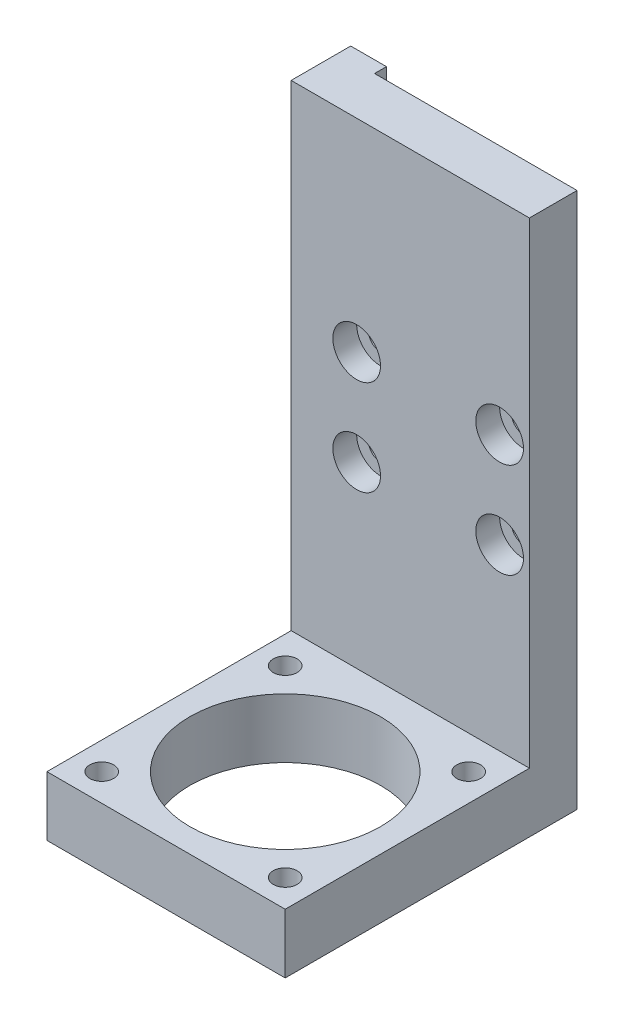
ISO-10303-21;
HEADER;
FILE_DESCRIPTION(('STEP AP214'),'2;1');
FILE_NAME('part.step','',(''),(''),'','','');
FILE_SCHEMA(('AUTOMOTIVE_DESIGN { 1 0 10303 214 1 1 1 1 }'));
ENDSEC;
DATA;
#1=APPLICATION_CONTEXT('core data for automotive mechanical design processes');
#2=APPLICATION_PROTOCOL_DEFINITION('international standard','automotive_design',2000,#1);
#3=PRODUCT_CONTEXT('',#1,'mechanical');
#4=PRODUCT('Part','Part','',(#3));
#5=PRODUCT_RELATED_PRODUCT_CATEGORY('part','',(#4));
#6=PRODUCT_DEFINITION_FORMATION('','',#4);
#7=PRODUCT_DEFINITION_CONTEXT('part definition',#1,'design');
#8=PRODUCT_DEFINITION('design','',#6,#7);
#9=PRODUCT_DEFINITION_SHAPE('','',#8);
#10=(LENGTH_UNIT() NAMED_UNIT(*) SI_UNIT(.MILLI.,.METRE.));
#11=(NAMED_UNIT(*) PLANE_ANGLE_UNIT() SI_UNIT($,.RADIAN.));
#12=(NAMED_UNIT(*) SI_UNIT($,.STERADIAN.) SOLID_ANGLE_UNIT());
#13=UNCERTAINTY_MEASURE_WITH_UNIT(LENGTH_MEASURE(1.E-05),#10,'distance_accuracy_value','');
#14=(GEOMETRIC_REPRESENTATION_CONTEXT(3) GLOBAL_UNCERTAINTY_ASSIGNED_CONTEXT((#13)) GLOBAL_UNIT_ASSIGNED_CONTEXT((#10,
#11,#12)) REPRESENTATION_CONTEXT('',''));
#15=CARTESIAN_POINT('',(0.,0.,0.));
#16=DIRECTION('',(0.,0.,1.));
#17=DIRECTION('',(1.,0.,0.));
#18=AXIS2_PLACEMENT_3D('',#15,#16,#17);
#19=CARTESIAN_POINT('',(5.5,15.,-30.5));
#20=DIRECTION('',(0.,0.,1.));
#21=DIRECTION('',(1.,0.,0.));
#22=AXIS2_PLACEMENT_3D('',#19,#20,#21);
#23=CYLINDRICAL_SURFACE('',#22,1.);
#24=CARTESIAN_POINT('',(5.5,15.,-24.5));
#25=DIRECTION('',(0.,0.,1.));
#26=DIRECTION('',(1.,0.,0.));
#27=AXIS2_PLACEMENT_3D('',#24,#25,#26);
#28=CIRCLE('',#27,1.);
#29=CARTESIAN_POINT('',(6.5,15.,-24.5));
#30=VERTEX_POINT('',#29);
#31=EDGE_CURVE('E542',#30,#30,#28,.F.);
#32=ORIENTED_EDGE('',*,*,#31,.T.);
#33=EDGE_LOOP('',(#32));
#34=FACE_BOUND('',#33,.T.);
#35=CARTESIAN_POINT('',(5.5,15.,-22.5));
#36=DIRECTION('',(0.,0.,1.));
#37=DIRECTION('',(1.,0.,0.));
#38=AXIS2_PLACEMENT_3D('',#35,#36,#37);
#39=CIRCLE('',#38,1.);
#40=CARTESIAN_POINT('',(6.5,15.,-22.5));
#41=VERTEX_POINT('',#40);
#42=EDGE_CURVE('E152',#41,#41,#39,.F.);
#43=ORIENTED_EDGE('',*,*,#42,.F.);
#44=EDGE_LOOP('',(#43));
#45=FACE_BOUND('',#44,.T.);
#46=ADVANCED_FACE('F36',(#34,#45),#23,.F.);
#47=CARTESIAN_POINT('',(5.50000000000001,23.,-30.5));
#48=DIRECTION('',(0.,0.,1.));
#49=DIRECTION('',(1.,0.,0.));
#50=AXIS2_PLACEMENT_3D('',#47,#48,#49);
#51=CYLINDRICAL_SURFACE('',#50,1.);
#52=CARTESIAN_POINT('',(5.50000000000001,23.,-24.5));
#53=DIRECTION('',(0.,0.,1.));
#54=DIRECTION('',(1.,0.,0.));
#55=AXIS2_PLACEMENT_3D('',#52,#53,#54);
#56=CIRCLE('',#55,1.);
#57=CARTESIAN_POINT('',(6.50000000000001,23.,-24.5));
#58=VERTEX_POINT('',#57);
#59=EDGE_CURVE('E547',#58,#58,#56,.F.);
#60=ORIENTED_EDGE('',*,*,#59,.T.);
#61=EDGE_LOOP('',(#60));
#62=FACE_BOUND('',#61,.T.);
#63=CARTESIAN_POINT('',(5.50000000000001,23.,-22.5));
#64=DIRECTION('',(0.,0.,1.));
#65=DIRECTION('',(1.,0.,0.));
#66=AXIS2_PLACEMENT_3D('',#63,#64,#65);
#67=CIRCLE('',#66,1.);
#68=CARTESIAN_POINT('',(6.50000000000001,23.,-22.5));
#69=VERTEX_POINT('',#68);
#70=EDGE_CURVE('E150',#69,#69,#67,.F.);
#71=ORIENTED_EDGE('',*,*,#70,.F.);
#72=EDGE_LOOP('',(#71));
#73=FACE_BOUND('',#72,.T.);
#74=ADVANCED_FACE('F236',(#62,#73),#51,.F.);
#75=CARTESIAN_POINT('',(17.5,23.,-30.5));
#76=DIRECTION('',(0.,0.,1.));
#77=DIRECTION('',(1.,0.,0.));
#78=AXIS2_PLACEMENT_3D('',#75,#76,#77);
#79=CYLINDRICAL_SURFACE('',#78,1.00000000000001);
#80=CARTESIAN_POINT('',(17.5,23.,-24.5));
#81=DIRECTION('',(0.,0.,1.));
#82=DIRECTION('',(1.,0.,0.));
#83=AXIS2_PLACEMENT_3D('',#80,#81,#82);
#84=CIRCLE('',#83,1.00000000000001);
#85=CARTESIAN_POINT('',(18.5,23.,-24.5));
#86=VERTEX_POINT('',#85);
#87=EDGE_CURVE('E601',#86,#86,#84,.F.);
#88=ORIENTED_EDGE('',*,*,#87,.T.);
#89=EDGE_LOOP('',(#88));
#90=FACE_BOUND('',#89,.T.);
#91=CARTESIAN_POINT('',(17.5,23.,-22.5));
#92=DIRECTION('',(0.,0.,1.));
#93=DIRECTION('',(1.,0.,0.));
#94=AXIS2_PLACEMENT_3D('',#91,#92,#93);
#95=CIRCLE('',#94,1.00000000000001);
#96=CARTESIAN_POINT('',(18.5,23.,-22.5));
#97=VERTEX_POINT('',#96);
#98=EDGE_CURVE('E146',#97,#97,#95,.F.);
#99=ORIENTED_EDGE('',*,*,#98,.F.);
#100=EDGE_LOOP('',(#99));
#101=FACE_BOUND('',#100,.T.);
#102=ADVANCED_FACE('F243',(#90,#101),#79,.F.);
#103=CARTESIAN_POINT('',(17.5,15.,-30.5));
#104=DIRECTION('',(0.,0.,1.));
#105=DIRECTION('',(1.,0.,0.));
#106=AXIS2_PLACEMENT_3D('',#103,#104,#105);
#107=CYLINDRICAL_SURFACE('',#106,1.00000000000001);
#108=CARTESIAN_POINT('',(17.5,15.,-24.5));
#109=DIRECTION('',(0.,0.,1.));
#110=DIRECTION('',(1.,0.,0.));
#111=AXIS2_PLACEMENT_3D('',#108,#109,#110);
#112=CIRCLE('',#111,1.00000000000001);
#113=CARTESIAN_POINT('',(18.5,15.,-24.5));
#114=VERTEX_POINT('',#113);
#115=EDGE_CURVE('E604',#114,#114,#112,.F.);
#116=ORIENTED_EDGE('',*,*,#115,.T.);
#117=EDGE_LOOP('',(#116));
#118=FACE_BOUND('',#117,.T.);
#119=CARTESIAN_POINT('',(17.5,15.,-22.5));
#120=DIRECTION('',(0.,0.,1.));
#121=DIRECTION('',(1.,0.,0.));
#122=AXIS2_PLACEMENT_3D('',#119,#120,#121);
#123=CIRCLE('',#122,1.00000000000001);
#124=CARTESIAN_POINT('',(18.5,15.,-22.5));
#125=VERTEX_POINT('',#124);
#126=EDGE_CURVE('E143',#125,#125,#123,.F.);
#127=ORIENTED_EDGE('',*,*,#126,.F.);
#128=EDGE_LOOP('',(#127));
#129=FACE_BOUND('',#128,.T.);
#130=ADVANCED_FACE('F250',(#118,#129),#107,.F.);
#131=CARTESIAN_POINT('',(20.,-5.,0.));
#132=DIRECTION('',(0.,0.,-1.));
#133=DIRECTION('',(-1.,0.,0.));
#134=AXIS2_PLACEMENT_3D('',#131,#132,#133);
#135=PLANE('',#134);
#136=DIRECTION('',(0.,-1.,0.));
#137=VECTOR('',#136,1.);
#138=CARTESIAN_POINT('',(0.,-5.,0.));
#139=LINE('',#138,#137);
#140=CARTESIAN_POINT('',(0.,0.,0.));
#141=VERTEX_POINT('',#140);
#142=CARTESIAN_POINT('',(0.,-5.,0.));
#143=VERTEX_POINT('',#142);
#144=EDGE_CURVE('E186',#141,#143,#139,.T.);
#145=ORIENTED_EDGE('',*,*,#144,.T.);
#146=DIRECTION('',(-1.,0.,0.));
#147=VECTOR('',#146,1.);
#148=CARTESIAN_POINT('',(20.,-5.,0.));
#149=LINE('',#148,#147);
#150=CARTESIAN_POINT('',(20.,-5.,0.));
#151=VERTEX_POINT('',#150);
#152=EDGE_CURVE('E44',#151,#143,#149,.T.);
#153=ORIENTED_EDGE('',*,*,#152,.F.);
#154=DIRECTION('',(0.,-1.,0.));
#155=VECTOR('',#154,1.);
#156=CARTESIAN_POINT('',(20.,-5.,0.));
#157=LINE('',#156,#155);
#158=CARTESIAN_POINT('',(20.,0.,0.));
#159=VERTEX_POINT('',#158);
#160=EDGE_CURVE('E187',#159,#151,#157,.T.);
#161=ORIENTED_EDGE('',*,*,#160,.F.);
#162=DIRECTION('',(-1.,0.,0.));
#163=VECTOR('',#162,1.);
#164=CARTESIAN_POINT('',(20.,0.,0.));
#165=LINE('',#164,#163);
#166=EDGE_CURVE('E195',#159,#141,#165,.T.);
#167=ORIENTED_EDGE('',*,*,#166,.T.);
#168=EDGE_LOOP('',(#145,#153,#161,#167));
#169=FACE_BOUND('',#168,.T.);
#170=ADVANCED_FACE('F38',(#169),#135,.F.);
#171=CARTESIAN_POINT('',(20.,-5.,-25.5));
#172=DIRECTION('',(0.,1.,0.));
#173=DIRECTION('',(0.,0.,1.));
#174=AXIS2_PLACEMENT_3D('',#171,#172,#173);
#175=PLANE('',#174);
#176=CARTESIAN_POINT('',(2.3,-5.,-2.3));
#177=DIRECTION('',(0.,1.,0.));
#178=DIRECTION('',(0.,0.,1.));
#179=AXIS2_PLACEMENT_3D('',#176,#177,#178);
#180=CIRCLE('',#179,1.);
#181=CARTESIAN_POINT('',(2.3,-5.,-1.3));
#182=VERTEX_POINT('',#181);
#183=EDGE_CURVE('E183',#182,#182,#180,.T.);
#184=ORIENTED_EDGE('',*,*,#183,.T.);
#185=EDGE_LOOP('',(#184));
#186=FACE_BOUND('',#185,.T.);
#187=CARTESIAN_POINT('',(17.7,-5.,-2.3));
#188=DIRECTION('',(0.,1.,0.));
#189=DIRECTION('',(0.,0.,1.));
#190=AXIS2_PLACEMENT_3D('',#187,#188,#189);
#191=CIRCLE('',#190,1.);
#192=CARTESIAN_POINT('',(17.7,-5.,-1.3));
#193=VERTEX_POINT('',#192);
#194=EDGE_CURVE('E180',#193,#193,#191,.T.);
#195=ORIENTED_EDGE('',*,*,#194,.T.);
#196=EDGE_LOOP('',(#195));
#197=FACE_BOUND('',#196,.T.);
#198=CARTESIAN_POINT('',(17.7,-5.,-17.7));
#199=DIRECTION('',(0.,1.,0.));
#200=DIRECTION('',(0.,0.,1.));
#201=AXIS2_PLACEMENT_3D('',#198,#199,#200);
#202=CIRCLE('',#201,1.);
#203=CARTESIAN_POINT('',(17.7,-5.,-16.7));
#204=VERTEX_POINT('',#203);
#205=EDGE_CURVE('E177',#204,#204,#202,.T.);
#206=ORIENTED_EDGE('',*,*,#205,.T.);
#207=EDGE_LOOP('',(#206));
#208=FACE_BOUND('',#207,.T.);
#209=CARTESIAN_POINT('',(2.3,-5.,-17.7));
#210=DIRECTION('',(0.,1.,0.));
#211=DIRECTION('',(0.,0.,1.));
#212=AXIS2_PLACEMENT_3D('',#209,#210,#211);
#213=CIRCLE('',#212,1.);
#214=CARTESIAN_POINT('',(2.3,-5.,-16.7));
#215=VERTEX_POINT('',#214);
#216=EDGE_CURVE('E174',#215,#215,#213,.T.);
#217=ORIENTED_EDGE('',*,*,#216,.T.);
#218=EDGE_LOOP('',(#217));
#219=FACE_BOUND('',#218,.T.);
#220=CARTESIAN_POINT('',(10.,-5.,-10.));
#221=DIRECTION('',(0.,1.,0.));
#222=DIRECTION('',(0.,0.,1.));
#223=AXIS2_PLACEMENT_3D('',#220,#221,#222);
#224=CIRCLE('',#223,8.);
#225=CARTESIAN_POINT('',(10.,-5.,-2.));
#226=VERTEX_POINT('',#225);
#227=EDGE_CURVE('E170',#226,#226,#224,.T.);
#228=ORIENTED_EDGE('',*,*,#227,.T.);
#229=EDGE_LOOP('',(#228));
#230=FACE_BOUND('',#229,.T.);
#231=DIRECTION('',(0.,0.,1.));
#232=VECTOR('',#231,1.);
#233=CARTESIAN_POINT('',(3.,-5.,-25.5));
#234=LINE('',#233,#232);
#235=CARTESIAN_POINT('',(3.,-5.,-25.5));
#236=VERTEX_POINT('',#235);
#237=CARTESIAN_POINT('',(3.,-5.,-24.5));
#238=VERTEX_POINT('',#237);
#239=EDGE_CURVE('E117',#236,#238,#234,.T.);
#240=ORIENTED_EDGE('',*,*,#239,.T.);
#241=DIRECTION('',(1.,0.,0.));
#242=VECTOR('',#241,1.);
#243=CARTESIAN_POINT('',(20.,-5.,-24.5));
#244=LINE('',#243,#242);
#245=CARTESIAN_POINT('',(20.,-5.,-24.5));
#246=VERTEX_POINT('',#245);
#247=EDGE_CURVE('E540',#238,#246,#244,.T.);
#248=ORIENTED_EDGE('',*,*,#247,.T.);
#249=DIRECTION('',(0.,0.,-1.));
#250=VECTOR('',#249,1.);
#251=CARTESIAN_POINT('',(20.,-5.,-25.5));
#252=LINE('',#251,#250);
#253=EDGE_CURVE('E94',#151,#246,#252,.T.);
#254=ORIENTED_EDGE('',*,*,#253,.F.);
#255=ORIENTED_EDGE('',*,*,#152,.T.);
#256=DIRECTION('',(0.,0.,-1.));
#257=VECTOR('',#256,1.);
#258=CARTESIAN_POINT('',(0.,-5.,-25.5));
#259=LINE('',#258,#257);
#260=CARTESIAN_POINT('',(0.,-5.,-25.5));
#261=VERTEX_POINT('',#260);
#262=EDGE_CURVE('E198',#143,#261,#259,.T.);
#263=ORIENTED_EDGE('',*,*,#262,.T.);
#264=DIRECTION('',(-1.,0.,0.));
#265=VECTOR('',#264,1.);
#266=CARTESIAN_POINT('',(20.,-5.,-25.5));
#267=LINE('',#266,#265);
#268=EDGE_CURVE('E133',#236,#261,#267,.T.);
#269=ORIENTED_EDGE('',*,*,#268,.F.);
#270=EDGE_LOOP('',(#240,#248,#254,#255,#263,#269));
#271=FACE_BOUND('',#270,.T.);
#272=ADVANCED_FACE('F460',(#186,#197,#208,#219,#230,#271),#175,.F.);
#273=CARTESIAN_POINT('',(20.,40.,-25.5));
#274=DIRECTION('',(0.,0.,1.));
#275=DIRECTION('',(0.,-1.,0.));
#276=AXIS2_PLACEMENT_3D('',#273,#274,#275);
#277=PLANE('',#276);
#278=DIRECTION('',(-1.,0.,0.));
#279=VECTOR('',#278,1.);
#280=CARTESIAN_POINT('',(20.,40.,-25.5));
#281=LINE('',#280,#279);
#282=CARTESIAN_POINT('',(3.,40.,-25.5));
#283=VERTEX_POINT('',#282);
#284=CARTESIAN_POINT('',(0.,40.,-25.5));
#285=VERTEX_POINT('',#284);
#286=EDGE_CURVE('E126',#283,#285,#281,.T.);
#287=ORIENTED_EDGE('',*,*,#286,.F.);
#288=DIRECTION('',(0.,1.,0.));
#289=VECTOR('',#288,1.);
#290=CARTESIAN_POINT('',(3.,-25.,-25.5));
#291=LINE('',#290,#289);
#292=EDGE_CURVE('E111',#236,#283,#291,.T.);
#293=ORIENTED_EDGE('',*,*,#292,.F.);
#294=ORIENTED_EDGE('',*,*,#268,.T.);
#295=DIRECTION('',(0.,1.,0.));
#296=VECTOR('',#295,1.);
#297=CARTESIAN_POINT('',(0.,40.,-25.5));
#298=LINE('',#297,#296);
#299=EDGE_CURVE('E131',#261,#285,#298,.T.);
#300=ORIENTED_EDGE('',*,*,#299,.T.);
#301=EDGE_LOOP('',(#287,#293,#294,#300));
#302=FACE_BOUND('',#301,.T.);
#303=ADVANCED_FACE('F129',(#302),#277,.F.);
#304=CARTESIAN_POINT('',(20.,40.,-20.5));
#305=DIRECTION('',(0.,-1.,0.));
#306=DIRECTION('',(0.,0.,-1.));
#307=AXIS2_PLACEMENT_3D('',#304,#305,#306);
#308=PLANE('',#307);
#309=DIRECTION('',(0.,0.,1.));
#310=VECTOR('',#309,1.);
#311=CARTESIAN_POINT('',(20.,40.,-20.5));
#312=LINE('',#311,#310);
#313=CARTESIAN_POINT('',(20.,40.,-24.5));
#314=VERTEX_POINT('',#313);
#315=CARTESIAN_POINT('',(20.,40.,-20.5));
#316=VERTEX_POINT('',#315);
#317=EDGE_CURVE('E190',#314,#316,#312,.T.);
#318=ORIENTED_EDGE('',*,*,#317,.F.);
#319=DIRECTION('',(1.,0.,0.));
#320=VECTOR('',#319,1.);
#321=CARTESIAN_POINT('',(20.,40.,-24.5));
#322=LINE('',#321,#320);
#323=CARTESIAN_POINT('',(3.,40.,-24.5));
#324=VERTEX_POINT('',#323);
#325=EDGE_CURVE('E51',#324,#314,#322,.T.);
#326=ORIENTED_EDGE('',*,*,#325,.F.);
#327=DIRECTION('',(0.,0.,1.));
#328=VECTOR('',#327,1.);
#329=CARTESIAN_POINT('',(3.,40.,-25.5));
#330=LINE('',#329,#328);
#331=EDGE_CURVE('E115',#283,#324,#330,.T.);
#332=ORIENTED_EDGE('',*,*,#331,.F.);
#333=ORIENTED_EDGE('',*,*,#286,.T.);
#334=DIRECTION('',(0.,0.,1.));
#335=VECTOR('',#334,1.);
#336=CARTESIAN_POINT('',(0.,40.,-20.5));
#337=LINE('',#336,#335);
#338=CARTESIAN_POINT('',(0.,40.,-20.5));
#339=VERTEX_POINT('',#338);
#340=EDGE_CURVE('E202',#285,#339,#337,.T.);
#341=ORIENTED_EDGE('',*,*,#340,.T.);
#342=DIRECTION('',(-1.,0.,0.));
#343=VECTOR('',#342,1.);
#344=CARTESIAN_POINT('',(20.,40.,-20.5));
#345=LINE('',#344,#343);
#346=EDGE_CURVE('E134',#316,#339,#345,.T.);
#347=ORIENTED_EDGE('',*,*,#346,.F.);
#348=EDGE_LOOP('',(#318,#326,#332,#333,#341,#347));
#349=FACE_BOUND('',#348,.T.);
#350=ADVANCED_FACE('F125',(#349),#308,.F.);
#351=CARTESIAN_POINT('',(20.,0.,-20.5));
#352=DIRECTION('',(0.,0.,-1.));
#353=DIRECTION('',(-1.,0.,0.));
#354=AXIS2_PLACEMENT_3D('',#351,#352,#353);
#355=PLANE('',#354);
#356=CARTESIAN_POINT('',(17.5,23.,-20.5));
#357=DIRECTION('',(0.,0.,1.));
#358=DIRECTION('',(1.,0.,0.));
#359=AXIS2_PLACEMENT_3D('',#356,#357,#358);
#360=CIRCLE('',#359,2.);
#361=CARTESIAN_POINT('',(19.5,23.,-20.5));
#362=VERTEX_POINT('',#361);
#363=EDGE_CURVE('E545',#362,#362,#360,.T.);
#364=ORIENTED_EDGE('',*,*,#363,.F.);
#365=EDGE_LOOP('',(#364));
#366=FACE_BOUND('',#365,.T.);
#367=CARTESIAN_POINT('',(17.5,15.,-20.5));
#368=DIRECTION('',(0.,0.,1.));
#369=DIRECTION('',(1.,0.,0.));
#370=AXIS2_PLACEMENT_3D('',#367,#368,#369);
#371=CIRCLE('',#370,2.);
#372=CARTESIAN_POINT('',(19.5,15.,-20.5));
#373=VERTEX_POINT('',#372);
#374=EDGE_CURVE('E558',#373,#373,#371,.T.);
#375=ORIENTED_EDGE('',*,*,#374,.F.);
#376=EDGE_LOOP('',(#375));
#377=FACE_BOUND('',#376,.T.);
#378=CARTESIAN_POINT('',(5.5,15.,-20.5));
#379=DIRECTION('',(0.,0.,1.));
#380=DIRECTION('',(1.,0.,0.));
#381=AXIS2_PLACEMENT_3D('',#378,#379,#380);
#382=CIRCLE('',#381,2.);
#383=CARTESIAN_POINT('',(7.5,15.,-20.5));
#384=VERTEX_POINT('',#383);
#385=EDGE_CURVE('E551',#384,#384,#382,.T.);
#386=ORIENTED_EDGE('',*,*,#385,.F.);
#387=EDGE_LOOP('',(#386));
#388=FACE_BOUND('',#387,.T.);
#389=CARTESIAN_POINT('',(5.50000000000001,23.,-20.5));
#390=DIRECTION('',(0.,0.,1.));
#391=DIRECTION('',(1.,0.,0.));
#392=AXIS2_PLACEMENT_3D('',#389,#390,#391);
#393=CIRCLE('',#392,2.);
#394=CARTESIAN_POINT('',(7.50000000000001,23.,-20.5));
#395=VERTEX_POINT('',#394);
#396=EDGE_CURVE('E554',#395,#395,#393,.T.);
#397=ORIENTED_EDGE('',*,*,#396,.F.);
#398=EDGE_LOOP('',(#397));
#399=FACE_BOUND('',#398,.T.);
#400=DIRECTION('',(0.,-1.,0.));
#401=VECTOR('',#400,1.);
#402=CARTESIAN_POINT('',(0.,0.,-20.5));
#403=LINE('',#402,#401);
#404=CARTESIAN_POINT('',(0.,0.,-20.5));
#405=VERTEX_POINT('',#404);
#406=EDGE_CURVE('E204',#339,#405,#403,.T.);
#407=ORIENTED_EDGE('',*,*,#406,.T.);
#408=DIRECTION('',(-1.,0.,0.));
#409=VECTOR('',#408,1.);
#410=CARTESIAN_POINT('',(20.,0.,-20.5));
#411=LINE('',#410,#409);
#412=CARTESIAN_POINT('',(20.,0.,-20.5));
#413=VERTEX_POINT('',#412);
#414=EDGE_CURVE('E138',#413,#405,#411,.T.);
#415=ORIENTED_EDGE('',*,*,#414,.F.);
#416=DIRECTION('',(0.,-1.,0.));
#417=VECTOR('',#416,1.);
#418=CARTESIAN_POINT('',(20.,0.,-20.5));
#419=LINE('',#418,#417);
#420=EDGE_CURVE('E192',#316,#413,#419,.T.);
#421=ORIENTED_EDGE('',*,*,#420,.F.);
#422=ORIENTED_EDGE('',*,*,#346,.T.);
#423=EDGE_LOOP('',(#407,#415,#421,#422));
#424=FACE_BOUND('',#423,.T.);
#425=ADVANCED_FACE('F220',(#366,#377,#388,#399,#424),#355,.F.);
#426=CARTESIAN_POINT('',(20.,0.,0.));
#427=DIRECTION('',(0.,-1.,0.));
#428=DIRECTION('',(0.,0.,-1.));
#429=AXIS2_PLACEMENT_3D('',#426,#427,#428);
#430=PLANE('',#429);
#431=CARTESIAN_POINT('',(2.3,0.,-2.3));
#432=DIRECTION('',(0.,1.,0.));
#433=DIRECTION('',(0.,0.,1.));
#434=AXIS2_PLACEMENT_3D('',#431,#432,#433);
#435=CIRCLE('',#434,1.);
#436=CARTESIAN_POINT('',(2.3,0.,-1.3));
#437=VERTEX_POINT('',#436);
#438=EDGE_CURVE('E154',#437,#437,#435,.T.);
#439=ORIENTED_EDGE('',*,*,#438,.F.);
#440=EDGE_LOOP('',(#439));
#441=FACE_BOUND('',#440,.T.);
#442=CARTESIAN_POINT('',(17.7,0.,-2.3));
#443=DIRECTION('',(0.,1.,0.));
#444=DIRECTION('',(0.,0.,1.));
#445=AXIS2_PLACEMENT_3D('',#442,#443,#444);
#446=CIRCLE('',#445,1.);
#447=CARTESIAN_POINT('',(17.7,0.,-1.3));
#448=VERTEX_POINT('',#447);
#449=EDGE_CURVE('E158',#448,#448,#446,.T.);
#450=ORIENTED_EDGE('',*,*,#449,.F.);
#451=EDGE_LOOP('',(#450));
#452=FACE_BOUND('',#451,.T.);
#453=CARTESIAN_POINT('',(17.7,0.,-17.7));
#454=DIRECTION('',(0.,1.,0.));
#455=DIRECTION('',(0.,0.,1.));
#456=AXIS2_PLACEMENT_3D('',#453,#454,#455);
#457=CIRCLE('',#456,1.);
#458=CARTESIAN_POINT('',(17.7,0.,-16.7));
#459=VERTEX_POINT('',#458);
#460=EDGE_CURVE('E163',#459,#459,#457,.T.);
#461=ORIENTED_EDGE('',*,*,#460,.F.);
#462=EDGE_LOOP('',(#461));
#463=FACE_BOUND('',#462,.T.);
#464=CARTESIAN_POINT('',(2.3,0.,-17.7));
#465=DIRECTION('',(0.,1.,0.));
#466=DIRECTION('',(0.,0.,1.));
#467=AXIS2_PLACEMENT_3D('',#464,#465,#466);
#468=CIRCLE('',#467,1.);
#469=CARTESIAN_POINT('',(2.3,0.,-16.7));
#470=VERTEX_POINT('',#469);
#471=EDGE_CURVE('E171',#470,#470,#468,.T.);
#472=ORIENTED_EDGE('',*,*,#471,.F.);
#473=EDGE_LOOP('',(#472));
#474=FACE_BOUND('',#473,.T.);
#475=CARTESIAN_POINT('',(10.,0.,-10.));
#476=DIRECTION('',(0.,1.,0.));
#477=DIRECTION('',(0.,0.,1.));
#478=AXIS2_PLACEMENT_3D('',#475,#476,#477);
#479=CIRCLE('',#478,8.);
#480=CARTESIAN_POINT('',(10.,0.,-2.));
#481=VERTEX_POINT('',#480);
#482=EDGE_CURVE('E167',#481,#481,#479,.T.);
#483=ORIENTED_EDGE('',*,*,#482,.F.);
#484=EDGE_LOOP('',(#483));
#485=FACE_BOUND('',#484,.T.);
#486=DIRECTION('',(0.,0.,1.));
#487=VECTOR('',#486,1.);
#488=CARTESIAN_POINT('',(0.,0.,0.));
#489=LINE('',#488,#487);
#490=EDGE_CURVE('E86',#405,#141,#489,.T.);
#491=ORIENTED_EDGE('',*,*,#490,.T.);
#492=ORIENTED_EDGE('',*,*,#166,.F.);
#493=DIRECTION('',(0.,0.,1.));
#494=VECTOR('',#493,1.);
#495=CARTESIAN_POINT('',(20.,0.,0.));
#496=LINE('',#495,#494);
#497=EDGE_CURVE('E59',#413,#159,#496,.T.);
#498=ORIENTED_EDGE('',*,*,#497,.F.);
#499=ORIENTED_EDGE('',*,*,#414,.T.);
#500=EDGE_LOOP('',(#491,#492,#498,#499));
#501=FACE_BOUND('',#500,.T.);
#502=ADVANCED_FACE('F208',(#441,#452,#463,#474,#485,#501),#430,.F.);
#503=CARTESIAN_POINT('',(20.,0.,0.));
#504=DIRECTION('',(-1.,0.,0.));
#505=DIRECTION('',(0.,0.,1.));
#506=AXIS2_PLACEMENT_3D('',#503,#504,#505);
#507=PLANE('',#506);
#508=ORIENTED_EDGE('',*,*,#253,.T.);
#509=DIRECTION('',(0.,1.,0.));
#510=VECTOR('',#509,1.);
#511=CARTESIAN_POINT('',(20.,0.,-24.5));
#512=LINE('',#511,#510);
#513=EDGE_CURVE('E11',#246,#314,#512,.T.);
#514=ORIENTED_EDGE('',*,*,#513,.T.);
#515=ORIENTED_EDGE('',*,*,#317,.T.);
#516=ORIENTED_EDGE('',*,*,#420,.T.);
#517=ORIENTED_EDGE('',*,*,#497,.T.);
#518=ORIENTED_EDGE('',*,*,#160,.T.);
#519=EDGE_LOOP('',(#508,#514,#515,#516,#517,#518));
#520=FACE_BOUND('',#519,.T.);
#521=ADVANCED_FACE('F218',(#520),#507,.F.);
#522=CARTESIAN_POINT('',(0.,0.,0.));
#523=DIRECTION('',(-1.,0.,0.));
#524=DIRECTION('',(0.,0.,1.));
#525=AXIS2_PLACEMENT_3D('',#522,#523,#524);
#526=PLANE('',#525);
#527=ORIENTED_EDGE('',*,*,#144,.F.);
#528=ORIENTED_EDGE('',*,*,#490,.F.);
#529=ORIENTED_EDGE('',*,*,#406,.F.);
#530=ORIENTED_EDGE('',*,*,#340,.F.);
#531=ORIENTED_EDGE('',*,*,#299,.F.);
#532=ORIENTED_EDGE('',*,*,#262,.F.);
#533=EDGE_LOOP('',(#527,#528,#529,#530,#531,#532));
#534=FACE_BOUND('',#533,.T.);
#535=ADVANCED_FACE('F214',(#534),#526,.T.);
#536=CARTESIAN_POINT('',(10.,-10.,-10.));
#537=DIRECTION('',(0.,1.,0.));
#538=DIRECTION('',(0.,0.,1.));
#539=AXIS2_PLACEMENT_3D('',#536,#537,#538);
#540=CYLINDRICAL_SURFACE('',#539,8.);
#541=ORIENTED_EDGE('',*,*,#482,.T.);
#542=EDGE_LOOP('',(#541));
#543=FACE_BOUND('',#542,.T.);
#544=ORIENTED_EDGE('',*,*,#227,.F.);
#545=EDGE_LOOP('',(#544));
#546=FACE_BOUND('',#545,.T.);
#547=ADVANCED_FACE('F256',(#543,#546),#540,.F.);
#548=CARTESIAN_POINT('',(2.3,-10.,-17.7));
#549=DIRECTION('',(0.,1.,0.));
#550=DIRECTION('',(0.,0.,1.));
#551=AXIS2_PLACEMENT_3D('',#548,#549,#550);
#552=CYLINDRICAL_SURFACE('',#551,1.);
#553=ORIENTED_EDGE('',*,*,#471,.T.);
#554=EDGE_LOOP('',(#553));
#555=FACE_BOUND('',#554,.T.);
#556=ORIENTED_EDGE('',*,*,#216,.F.);
#557=EDGE_LOOP('',(#556));
#558=FACE_BOUND('',#557,.T.);
#559=ADVANCED_FACE('F252',(#555,#558),#552,.F.);
#560=CARTESIAN_POINT('',(17.7,-10.,-17.7));
#561=DIRECTION('',(0.,1.,0.));
#562=DIRECTION('',(0.,0.,1.));
#563=AXIS2_PLACEMENT_3D('',#560,#561,#562);
#564=CYLINDRICAL_SURFACE('',#563,1.);
#565=ORIENTED_EDGE('',*,*,#460,.T.);
#566=EDGE_LOOP('',(#565));
#567=FACE_BOUND('',#566,.T.);
#568=ORIENTED_EDGE('',*,*,#205,.F.);
#569=EDGE_LOOP('',(#568));
#570=FACE_BOUND('',#569,.T.);
#571=ADVANCED_FACE('F255',(#567,#570),#564,.F.);
#572=CARTESIAN_POINT('',(17.7,-10.,-2.3));
#573=DIRECTION('',(0.,1.,0.));
#574=DIRECTION('',(0.,0.,1.));
#575=AXIS2_PLACEMENT_3D('',#572,#573,#574);
#576=CYLINDRICAL_SURFACE('',#575,1.);
#577=ORIENTED_EDGE('',*,*,#449,.T.);
#578=EDGE_LOOP('',(#577));
#579=FACE_BOUND('',#578,.T.);
#580=ORIENTED_EDGE('',*,*,#194,.F.);
#581=EDGE_LOOP('',(#580));
#582=FACE_BOUND('',#581,.T.);
#583=ADVANCED_FACE('F260',(#579,#582),#576,.F.);
#584=CARTESIAN_POINT('',(2.3,-10.,-2.3));
#585=DIRECTION('',(0.,1.,0.));
#586=DIRECTION('',(0.,0.,1.));
#587=AXIS2_PLACEMENT_3D('',#584,#585,#586);
#588=CYLINDRICAL_SURFACE('',#587,1.);
#589=ORIENTED_EDGE('',*,*,#438,.T.);
#590=EDGE_LOOP('',(#589));
#591=FACE_BOUND('',#590,.T.);
#592=ORIENTED_EDGE('',*,*,#183,.F.);
#593=EDGE_LOOP('',(#592));
#594=FACE_BOUND('',#593,.T.);
#595=ADVANCED_FACE('F264',(#591,#594),#588,.F.);
#596=CARTESIAN_POINT('',(17.5,15.,-22.5));
#597=DIRECTION('',(0.,0.,1.));
#598=DIRECTION('',(1.,0.,0.));
#599=AXIS2_PLACEMENT_3D('',#596,#597,#598);
#600=PLANE('',#599);
#601=CARTESIAN_POINT('',(17.5,15.,-22.5));
#602=DIRECTION('',(0.,0.,1.));
#603=DIRECTION('',(1.,0.,0.));
#604=AXIS2_PLACEMENT_3D('',#601,#602,#603);
#605=CIRCLE('',#604,2.);
#606=CARTESIAN_POINT('',(19.5,15.,-22.5));
#607=VERTEX_POINT('',#606);
#608=EDGE_CURVE('E561',#607,#607,#605,.T.);
#609=ORIENTED_EDGE('',*,*,#608,.T.);
#610=EDGE_LOOP('',(#609));
#611=FACE_BOUND('',#610,.T.);
#612=ORIENTED_EDGE('',*,*,#126,.T.);
#613=EDGE_LOOP('',(#612));
#614=FACE_BOUND('',#613,.T.);
#615=ADVANCED_FACE('F267',(#611,#614),#600,.T.);
#616=CARTESIAN_POINT('',(17.5,15.,-22.5));
#617=DIRECTION('',(0.,0.,1.));
#618=DIRECTION('',(1.,0.,0.));
#619=AXIS2_PLACEMENT_3D('',#616,#617,#618);
#620=CYLINDRICAL_SURFACE('',#619,2.);
#621=ORIENTED_EDGE('',*,*,#608,.F.);
#622=EDGE_LOOP('',(#621));
#623=FACE_BOUND('',#622,.T.);
#624=ORIENTED_EDGE('',*,*,#374,.T.);
#625=EDGE_LOOP('',(#624));
#626=FACE_BOUND('',#625,.T.);
#627=ADVANCED_FACE('F342',(#623,#626),#620,.F.);
#628=CARTESIAN_POINT('',(17.5,23.,-22.5));
#629=DIRECTION('',(0.,0.,1.));
#630=DIRECTION('',(1.,0.,0.));
#631=AXIS2_PLACEMENT_3D('',#628,#629,#630);
#632=PLANE('',#631);
#633=CARTESIAN_POINT('',(17.5,23.,-22.5));
#634=DIRECTION('',(0.,0.,1.));
#635=DIRECTION('',(1.,0.,0.));
#636=AXIS2_PLACEMENT_3D('',#633,#634,#635);
#637=CIRCLE('',#636,2.);
#638=CARTESIAN_POINT('',(19.5,23.,-22.5));
#639=VERTEX_POINT('',#638);
#640=EDGE_CURVE('E541',#639,#639,#637,.T.);
#641=ORIENTED_EDGE('',*,*,#640,.T.);
#642=EDGE_LOOP('',(#641));
#643=FACE_BOUND('',#642,.T.);
#644=ORIENTED_EDGE('',*,*,#98,.T.);
#645=EDGE_LOOP('',(#644));
#646=FACE_BOUND('',#645,.T.);
#647=ADVANCED_FACE('F353',(#643,#646),#632,.T.);
#648=CARTESIAN_POINT('',(17.5,23.,-22.5));
#649=DIRECTION('',(0.,0.,1.));
#650=DIRECTION('',(1.,0.,0.));
#651=AXIS2_PLACEMENT_3D('',#648,#649,#650);
#652=CYLINDRICAL_SURFACE('',#651,2.);
#653=ORIENTED_EDGE('',*,*,#640,.F.);
#654=EDGE_LOOP('',(#653));
#655=FACE_BOUND('',#654,.T.);
#656=ORIENTED_EDGE('',*,*,#363,.T.);
#657=EDGE_LOOP('',(#656));
#658=FACE_BOUND('',#657,.T.);
#659=ADVANCED_FACE('F364',(#655,#658),#652,.F.);
#660=CARTESIAN_POINT('',(5.50000000000001,23.,-22.5));
#661=DIRECTION('',(0.,0.,1.));
#662=DIRECTION('',(1.,0.,0.));
#663=AXIS2_PLACEMENT_3D('',#660,#661,#662);
#664=PLANE('',#663);
#665=CARTESIAN_POINT('',(5.50000000000001,23.,-22.5));
#666=DIRECTION('',(0.,0.,1.));
#667=DIRECTION('',(1.,0.,0.));
#668=AXIS2_PLACEMENT_3D('',#665,#666,#667);
#669=CIRCLE('',#668,2.);
#670=CARTESIAN_POINT('',(7.50000000000001,23.,-22.5));
#671=VERTEX_POINT('',#670);
#672=EDGE_CURVE('E147',#671,#671,#669,.T.);
#673=ORIENTED_EDGE('',*,*,#672,.T.);
#674=EDGE_LOOP('',(#673));
#675=FACE_BOUND('',#674,.T.);
#676=ORIENTED_EDGE('',*,*,#70,.T.);
#677=EDGE_LOOP('',(#676));
#678=FACE_BOUND('',#677,.T.);
#679=ADVANCED_FACE('F375',(#675,#678),#664,.T.);
#680=CARTESIAN_POINT('',(5.50000000000001,23.,-22.5));
#681=DIRECTION('',(0.,0.,1.));
#682=DIRECTION('',(1.,0.,0.));
#683=AXIS2_PLACEMENT_3D('',#680,#681,#682);
#684=CYLINDRICAL_SURFACE('',#683,2.);
#685=ORIENTED_EDGE('',*,*,#672,.F.);
#686=EDGE_LOOP('',(#685));
#687=FACE_BOUND('',#686,.T.);
#688=ORIENTED_EDGE('',*,*,#396,.T.);
#689=EDGE_LOOP('',(#688));
#690=FACE_BOUND('',#689,.T.);
#691=ADVANCED_FACE('F386',(#687,#690),#684,.F.);
#692=CARTESIAN_POINT('',(5.5,15.,-22.5));
#693=DIRECTION('',(0.,0.,1.));
#694=DIRECTION('',(1.,0.,0.));
#695=AXIS2_PLACEMENT_3D('',#692,#693,#694);
#696=PLANE('',#695);
#697=CARTESIAN_POINT('',(5.5,15.,-22.5));
#698=DIRECTION('',(0.,0.,1.));
#699=DIRECTION('',(1.,0.,0.));
#700=AXIS2_PLACEMENT_3D('',#697,#698,#699);
#701=CIRCLE('',#700,2.);
#702=CARTESIAN_POINT('',(7.5,15.,-22.5));
#703=VERTEX_POINT('',#702);
#704=EDGE_CURVE('E555',#703,#703,#701,.T.);
#705=ORIENTED_EDGE('',*,*,#704,.T.);
#706=EDGE_LOOP('',(#705));
#707=FACE_BOUND('',#706,.T.);
#708=ORIENTED_EDGE('',*,*,#42,.T.);
#709=EDGE_LOOP('',(#708));
#710=FACE_BOUND('',#709,.T.);
#711=ADVANCED_FACE('F397',(#707,#710),#696,.T.);
#712=CARTESIAN_POINT('',(5.5,15.,-22.5));
#713=DIRECTION('',(0.,0.,1.));
#714=DIRECTION('',(1.,0.,0.));
#715=AXIS2_PLACEMENT_3D('',#712,#713,#714);
#716=CYLINDRICAL_SURFACE('',#715,2.);
#717=ORIENTED_EDGE('',*,*,#704,.F.);
#718=EDGE_LOOP('',(#717));
#719=FACE_BOUND('',#718,.T.);
#720=ORIENTED_EDGE('',*,*,#385,.T.);
#721=EDGE_LOOP('',(#720));
#722=FACE_BOUND('',#721,.T.);
#723=ADVANCED_FACE('F408',(#719,#722),#716,.F.);
#724=CARTESIAN_POINT('',(3.,-25.,-25.5));
#725=DIRECTION('',(-1.,0.,0.));
#726=DIRECTION('',(0.,0.,1.));
#727=AXIS2_PLACEMENT_3D('',#724,#725,#726);
#728=PLANE('',#727);
#729=ORIENTED_EDGE('',*,*,#292,.T.);
#730=ORIENTED_EDGE('',*,*,#331,.T.);
#731=DIRECTION('',(0.,1.,0.));
#732=VECTOR('',#731,1.);
#733=CARTESIAN_POINT('',(3.,-25.,-24.5));
#734=LINE('',#733,#732);
#735=EDGE_CURVE('E121',#238,#324,#734,.T.);
#736=ORIENTED_EDGE('',*,*,#735,.F.);
#737=ORIENTED_EDGE('',*,*,#239,.F.);
#738=EDGE_LOOP('',(#729,#730,#736,#737));
#739=FACE_BOUND('',#738,.T.);
#740=ADVANCED_FACE('F113',(#739),#728,.F.);
#741=CARTESIAN_POINT('',(20.,-25.,-24.5));
#742=DIRECTION('',(0.,0.,1.));
#743=DIRECTION('',(1.,0.,0.));
#744=AXIS2_PLACEMENT_3D('',#741,#742,#743);
#745=PLANE('',#744);
#746=ORIENTED_EDGE('',*,*,#59,.F.);
#747=EDGE_LOOP('',(#746));
#748=FACE_BOUND('',#747,.T.);
#749=ORIENTED_EDGE('',*,*,#115,.F.);
#750=EDGE_LOOP('',(#749));
#751=FACE_BOUND('',#750,.T.);
#752=ORIENTED_EDGE('',*,*,#735,.T.);
#753=ORIENTED_EDGE('',*,*,#325,.T.);
#754=ORIENTED_EDGE('',*,*,#513,.F.);
#755=ORIENTED_EDGE('',*,*,#247,.F.);
#756=EDGE_LOOP('',(#752,#753,#754,#755));
#757=FACE_BOUND('',#756,.T.);
#758=ORIENTED_EDGE('',*,*,#87,.F.);
#759=EDGE_LOOP('',(#758));
#760=FACE_BOUND('',#759,.T.);
#761=ORIENTED_EDGE('',*,*,#31,.F.);
#762=EDGE_LOOP('',(#761));
#763=FACE_BOUND('',#762,.T.);
#764=ADVANCED_FACE('F429',(#748,#751,#757,#760,#763),#745,.F.);
#765=CLOSED_SHELL('',(#46,#74,#102,#130,#170,#272,#303,#350,#425,#502,#521,#535,#547,#559,#571,
#583,#595,#615,#627,#647,#659,#679,#691,#711,#723,#740,#764));
#766=MANIFOLD_SOLID_BREP('B2',#765);
#767=ADVANCED_BREP_SHAPE_REPRESENTATION('',(#18,#766),#14);
#768=SHAPE_DEFINITION_REPRESENTATION(#9,#767);
ENDSEC;
END-ISO-10303-21;
